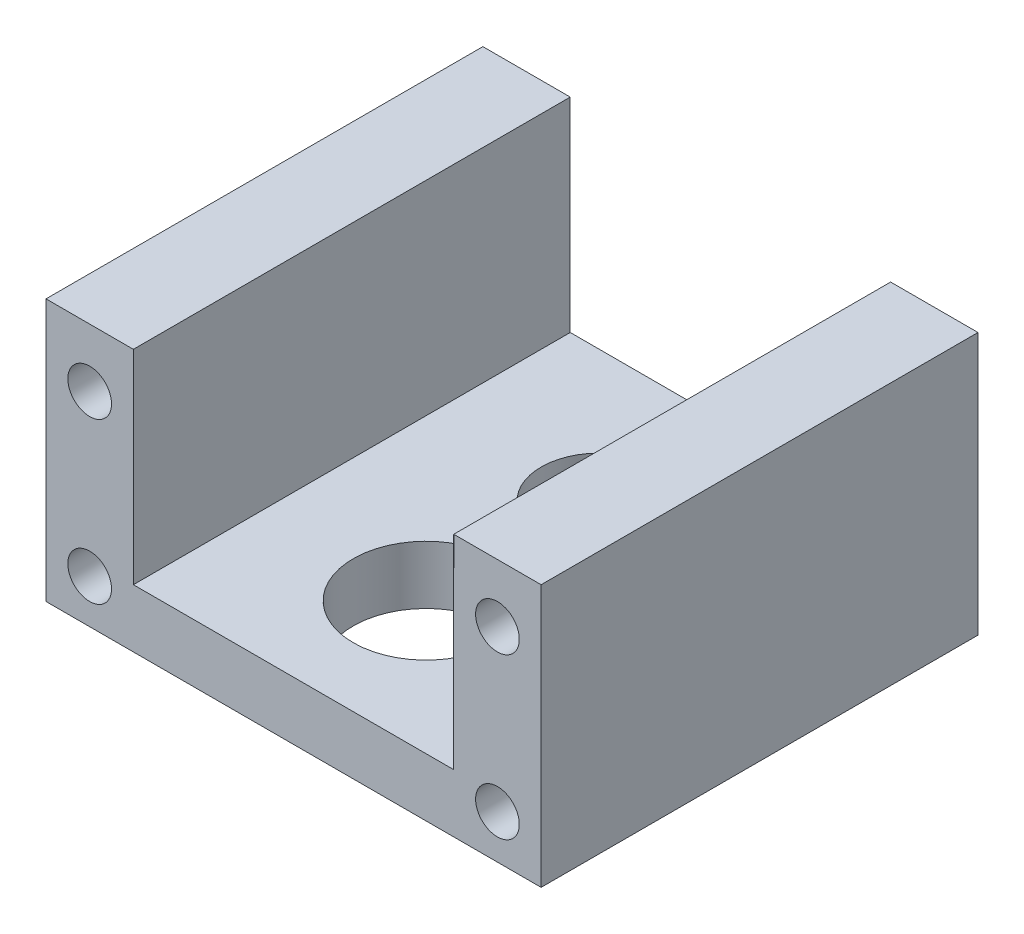
ISO-10303-21;
HEADER;
FILE_DESCRIPTION(('STEP AP214'),'2;1');
FILE_NAME('part.step','',(''),(''),'','','');
FILE_SCHEMA(('AUTOMOTIVE_DESIGN { 1 0 10303 214 1 1 1 1 }'));
ENDSEC;
DATA;
#1=APPLICATION_CONTEXT('core data for automotive mechanical design processes');
#2=APPLICATION_PROTOCOL_DEFINITION('international standard','automotive_design',2000,#1);
#3=PRODUCT_CONTEXT('',#1,'mechanical');
#4=PRODUCT('Part','Part','',(#3));
#5=PRODUCT_RELATED_PRODUCT_CATEGORY('part','',(#4));
#6=PRODUCT_DEFINITION_FORMATION('','',#4);
#7=PRODUCT_DEFINITION_CONTEXT('part definition',#1,'design');
#8=PRODUCT_DEFINITION('design','',#6,#7);
#9=PRODUCT_DEFINITION_SHAPE('','',#8);
#10=(LENGTH_UNIT() NAMED_UNIT(*) SI_UNIT(.MILLI.,.METRE.));
#11=(NAMED_UNIT(*) PLANE_ANGLE_UNIT() SI_UNIT($,.RADIAN.));
#12=(NAMED_UNIT(*) SI_UNIT($,.STERADIAN.) SOLID_ANGLE_UNIT());
#13=UNCERTAINTY_MEASURE_WITH_UNIT(LENGTH_MEASURE(1.E-05),#10,'distance_accuracy_value','');
#14=(GEOMETRIC_REPRESENTATION_CONTEXT(3) GLOBAL_UNCERTAINTY_ASSIGNED_CONTEXT((#13)) GLOBAL_UNIT_ASSIGNED_CONTEXT((#10,
#11,#12)) REPRESENTATION_CONTEXT('',''));
#15=CARTESIAN_POINT('',(0.,0.,0.));
#16=DIRECTION('',(0.,0.,1.));
#17=DIRECTION('',(1.,0.,0.));
#18=AXIS2_PLACEMENT_3D('',#15,#16,#17);
#19=CARTESIAN_POINT('',(0.,4.,0.));
#20=DIRECTION('',(0.,1.,0.));
#21=DIRECTION('',(0.,0.,1.));
#22=AXIS2_PLACEMENT_3D('',#19,#20,#21);
#23=PLANE('',#22);
#24=CARTESIAN_POINT('',(0.,4.,-6.));
#25=DIRECTION('',(0.,1.,0.));
#26=DIRECTION('',(0.,0.,1.));
#27=AXIS2_PLACEMENT_3D('',#24,#25,#26);
#28=CIRCLE('',#27,4.);
#29=CARTESIAN_POINT('',(0.,4.,-2.));
#30=VERTEX_POINT('',#29);
#31=EDGE_CURVE('E180',#30,#30,#28,.T.);
#32=ORIENTED_EDGE('',*,*,#31,.F.);
#33=EDGE_LOOP('',(#32));
#34=FACE_BOUND('',#33,.T.);
#35=CARTESIAN_POINT('',(0.,4.,5.9));
#36=DIRECTION('',(0.,1.,0.));
#37=DIRECTION('',(0.,0.,1.));
#38=AXIS2_PLACEMENT_3D('',#35,#36,#37);
#39=CIRCLE('',#38,5.);
#40=CARTESIAN_POINT('',(0.,4.,10.9));
#41=VERTEX_POINT('',#40);
#42=EDGE_CURVE('E181',#41,#41,#39,.T.);
#43=ORIENTED_EDGE('',*,*,#42,.F.);
#44=EDGE_LOOP('',(#43));
#45=FACE_BOUND('',#44,.T.);
#46=DIRECTION('',(-1.,0.,0.));
#47=VECTOR('',#46,1.);
#48=CARTESIAN_POINT('',(0.,4.,15.));
#49=LINE('',#48,#47);
#50=CARTESIAN_POINT('',(11.,4.,15.));
#51=VERTEX_POINT('',#50);
#52=CARTESIAN_POINT('',(-11.,4.,15.));
#53=VERTEX_POINT('',#52);
#54=EDGE_CURVE('E185',#51,#53,#49,.T.);
#55=ORIENTED_EDGE('',*,*,#54,.F.);
#56=DIRECTION('',(0.,0.,1.));
#57=VECTOR('',#56,1.);
#58=CARTESIAN_POINT('',(11.,4.,-15.));
#59=LINE('',#58,#57);
#60=CARTESIAN_POINT('',(11.,4.,-15.));
#61=VERTEX_POINT('',#60);
#62=EDGE_CURVE('E245',#61,#51,#59,.T.);
#63=ORIENTED_EDGE('',*,*,#62,.F.);
#64=DIRECTION('',(-1.,0.,0.));
#65=VECTOR('',#64,1.);
#66=CARTESIAN_POINT('',(0.,4.,-15.));
#67=LINE('',#66,#65);
#68=CARTESIAN_POINT('',(-11.,4.,-15.));
#69=VERTEX_POINT('',#68);
#70=EDGE_CURVE('E196',#61,#69,#67,.T.);
#71=ORIENTED_EDGE('',*,*,#70,.T.);
#72=DIRECTION('',(0.,0.,-1.));
#73=VECTOR('',#72,1.);
#74=CARTESIAN_POINT('',(-11.,4.,-15.));
#75=LINE('',#74,#73);
#76=EDGE_CURVE('E253',#53,#69,#75,.T.);
#77=ORIENTED_EDGE('',*,*,#76,.F.);
#78=EDGE_LOOP('',(#55,#63,#71,#77));
#79=FACE_BOUND('',#78,.T.);
#80=ADVANCED_FACE('F38',(#34,#45,#79),#23,.T.);
#81=CARTESIAN_POINT('',(-17.,4.,0.));
#82=DIRECTION('',(-1.,0.,0.));
#83=DIRECTION('',(0.,0.,1.));
#84=AXIS2_PLACEMENT_3D('',#81,#82,#83);
#85=PLANE('',#84);
#86=DIRECTION('',(0.,0.,-1.));
#87=VECTOR('',#86,1.);
#88=CARTESIAN_POINT('',(-17.,18.,15.));
#89=LINE('',#88,#87);
#90=CARTESIAN_POINT('',(-17.,18.,15.));
#91=VERTEX_POINT('',#90);
#92=CARTESIAN_POINT('',(-17.,18.,-15.));
#93=VERTEX_POINT('',#92);
#94=EDGE_CURVE('E117',#91,#93,#89,.T.);
#95=ORIENTED_EDGE('',*,*,#94,.T.);
#96=DIRECTION('',(0.,-1.,0.));
#97=VECTOR('',#96,1.);
#98=CARTESIAN_POINT('',(-17.,4.,-15.));
#99=LINE('',#98,#97);
#100=CARTESIAN_POINT('',(-17.,0.,-15.));
#101=VERTEX_POINT('',#100);
#102=EDGE_CURVE('E127',#93,#101,#99,.T.);
#103=ORIENTED_EDGE('',*,*,#102,.T.);
#104=DIRECTION('',(0.,0.,-1.));
#105=VECTOR('',#104,1.);
#106=CARTESIAN_POINT('',(-17.,0.,0.));
#107=LINE('',#106,#105);
#108=CARTESIAN_POINT('',(-17.,0.,15.));
#109=VERTEX_POINT('',#108);
#110=EDGE_CURVE('E202',#109,#101,#107,.T.);
#111=ORIENTED_EDGE('',*,*,#110,.F.);
#112=DIRECTION('',(0.,-1.,0.));
#113=VECTOR('',#112,1.);
#114=CARTESIAN_POINT('',(-17.,4.,15.));
#115=LINE('',#114,#113);
#116=EDGE_CURVE('E124',#91,#109,#115,.T.);
#117=ORIENTED_EDGE('',*,*,#116,.F.);
#118=EDGE_LOOP('',(#95,#103,#111,#117));
#119=FACE_BOUND('',#118,.T.);
#120=ADVANCED_FACE('F146',(#119),#85,.T.);
#121=CARTESIAN_POINT('',(0.,4.,15.));
#122=DIRECTION('',(0.,0.,1.));
#123=DIRECTION('',(1.,0.,0.));
#124=AXIS2_PLACEMENT_3D('',#121,#122,#123);
#125=PLANE('',#124);
#126=DIRECTION('',(-1.,0.,0.));
#127=VECTOR('',#126,1.);
#128=CARTESIAN_POINT('',(-17.,18.,15.));
#129=LINE('',#128,#127);
#130=CARTESIAN_POINT('',(-11.,18.,15.));
#131=VERTEX_POINT('',#130);
#132=EDGE_CURVE('E53',#131,#91,#129,.T.);
#133=ORIENTED_EDGE('',*,*,#132,.T.);
#134=ORIENTED_EDGE('',*,*,#116,.T.);
#135=DIRECTION('',(-1.,0.,0.));
#136=VECTOR('',#135,1.);
#137=CARTESIAN_POINT('',(0.,0.,15.));
#138=LINE('',#137,#136);
#139=CARTESIAN_POINT('',(17.,0.,15.));
#140=VERTEX_POINT('',#139);
#141=EDGE_CURVE('E123',#140,#109,#138,.T.);
#142=ORIENTED_EDGE('',*,*,#141,.F.);
#143=DIRECTION('',(0.,-1.,0.));
#144=VECTOR('',#143,1.);
#145=CARTESIAN_POINT('',(17.,4.,15.));
#146=LINE('',#145,#144);
#147=CARTESIAN_POINT('',(17.,18.,15.));
#148=VERTEX_POINT('',#147);
#149=EDGE_CURVE('E114',#148,#140,#146,.T.);
#150=ORIENTED_EDGE('',*,*,#149,.F.);
#151=CARTESIAN_POINT('',(11.,18.,15.));
#152=VERTEX_POINT('',#151);
#153=EDGE_CURVE('E101',#148,#152,#129,.T.);
#154=ORIENTED_EDGE('',*,*,#153,.T.);
#155=DIRECTION('',(0.,-1.,0.));
#156=VECTOR('',#155,1.);
#157=CARTESIAN_POINT('',(11.,19.,15.));
#158=LINE('',#157,#156);
#159=EDGE_CURVE('E250',#152,#51,#158,.T.);
#160=ORIENTED_EDGE('',*,*,#159,.T.);
#161=ORIENTED_EDGE('',*,*,#54,.T.);
#162=DIRECTION('',(0.,-1.,0.));
#163=VECTOR('',#162,1.);
#164=CARTESIAN_POINT('',(-11.,19.,15.));
#165=LINE('',#164,#163);
#166=EDGE_CURVE('E191',#131,#53,#165,.T.);
#167=ORIENTED_EDGE('',*,*,#166,.F.);
#168=EDGE_LOOP('',(#133,#134,#142,#150,#154,#160,#161,#167));
#169=FACE_BOUND('',#168,.T.);
#170=CARTESIAN_POINT('',(14.,14.,15.));
#171=DIRECTION('',(0.,0.,-1.));
#172=DIRECTION('',(-1.,0.,0.));
#173=AXIS2_PLACEMENT_3D('',#170,#171,#172);
#174=CIRCLE('',#173,1.5);
#175=CARTESIAN_POINT('',(12.5,14.,15.));
#176=VERTEX_POINT('',#175);
#177=EDGE_CURVE('E230',#176,#176,#174,.T.);
#178=ORIENTED_EDGE('',*,*,#177,.T.);
#179=EDGE_LOOP('',(#178));
#180=FACE_BOUND('',#179,.T.);
#181=CARTESIAN_POINT('',(-14.,3.,15.));
#182=DIRECTION('',(0.,0.,-1.));
#183=DIRECTION('',(1.,0.,0.));
#184=AXIS2_PLACEMENT_3D('',#181,#182,#183);
#185=CIRCLE('',#184,1.5);
#186=CARTESIAN_POINT('',(-12.5,3.,15.));
#187=VERTEX_POINT('',#186);
#188=EDGE_CURVE('E237',#187,#187,#185,.T.);
#189=ORIENTED_EDGE('',*,*,#188,.T.);
#190=EDGE_LOOP('',(#189));
#191=FACE_BOUND('',#190,.T.);
#192=CARTESIAN_POINT('',(-14.,14.,15.));
#193=DIRECTION('',(0.,0.,-1.));
#194=DIRECTION('',(1.,0.,0.));
#195=AXIS2_PLACEMENT_3D('',#192,#193,#194);
#196=CIRCLE('',#195,1.5);
#197=CARTESIAN_POINT('',(-12.5,14.,15.));
#198=VERTEX_POINT('',#197);
#199=EDGE_CURVE('E224',#198,#198,#196,.T.);
#200=ORIENTED_EDGE('',*,*,#199,.T.);
#201=EDGE_LOOP('',(#200));
#202=FACE_BOUND('',#201,.T.);
#203=CARTESIAN_POINT('',(14.,3.,15.));
#204=DIRECTION('',(0.,0.,-1.));
#205=DIRECTION('',(-1.,0.,0.));
#206=AXIS2_PLACEMENT_3D('',#203,#204,#205);
#207=CIRCLE('',#206,1.5);
#208=CARTESIAN_POINT('',(12.5,3.,15.));
#209=VERTEX_POINT('',#208);
#210=EDGE_CURVE('E242',#209,#209,#207,.T.);
#211=ORIENTED_EDGE('',*,*,#210,.T.);
#212=EDGE_LOOP('',(#211));
#213=FACE_BOUND('',#212,.T.);
#214=ADVANCED_FACE('F120',(#169,#180,#191,#202,#213),#125,.T.);
#215=CARTESIAN_POINT('',(17.,4.,0.));
#216=DIRECTION('',(-1.,0.,0.));
#217=DIRECTION('',(0.,0.,1.));
#218=AXIS2_PLACEMENT_3D('',#215,#216,#217);
#219=PLANE('',#218);
#220=DIRECTION('',(0.,-1.,0.));
#221=VECTOR('',#220,1.);
#222=CARTESIAN_POINT('',(17.,4.,-15.));
#223=LINE('',#222,#221);
#224=CARTESIAN_POINT('',(17.,18.,-15.));
#225=VERTEX_POINT('',#224);
#226=CARTESIAN_POINT('',(17.,0.,-15.));
#227=VERTEX_POINT('',#226);
#228=EDGE_CURVE('E116',#225,#227,#223,.T.);
#229=ORIENTED_EDGE('',*,*,#228,.F.);
#230=DIRECTION('',(0.,0.,-1.));
#231=VECTOR('',#230,1.);
#232=CARTESIAN_POINT('',(17.,18.,15.));
#233=LINE('',#232,#231);
#234=EDGE_CURVE('E104',#148,#225,#233,.T.);
#235=ORIENTED_EDGE('',*,*,#234,.F.);
#236=ORIENTED_EDGE('',*,*,#149,.T.);
#237=DIRECTION('',(0.,0.,-1.));
#238=VECTOR('',#237,1.);
#239=CARTESIAN_POINT('',(17.,0.,0.));
#240=LINE('',#239,#238);
#241=EDGE_CURVE('E188',#140,#227,#240,.T.);
#242=ORIENTED_EDGE('',*,*,#241,.T.);
#243=EDGE_LOOP('',(#229,#235,#236,#242));
#244=FACE_BOUND('',#243,.T.);
#245=ADVANCED_FACE('F112',(#244),#219,.F.);
#246=CARTESIAN_POINT('',(0.,4.,5.9));
#247=DIRECTION('',(0.,-1.,0.));
#248=DIRECTION('',(0.,0.,-1.));
#249=AXIS2_PLACEMENT_3D('',#246,#247,#248);
#250=CYLINDRICAL_SURFACE('',#249,5.);
#251=ORIENTED_EDGE('',*,*,#42,.T.);
#252=EDGE_LOOP('',(#251));
#253=FACE_BOUND('',#252,.T.);
#254=CARTESIAN_POINT('',(0.,0.,5.9));
#255=DIRECTION('',(0.,1.,0.));
#256=DIRECTION('',(0.,0.,1.));
#257=AXIS2_PLACEMENT_3D('',#254,#255,#256);
#258=CIRCLE('',#257,5.);
#259=CARTESIAN_POINT('',(0.,0.,10.9));
#260=VERTEX_POINT('',#259);
#261=EDGE_CURVE('E199',#260,#260,#258,.T.);
#262=ORIENTED_EDGE('',*,*,#261,.F.);
#263=EDGE_LOOP('',(#262));
#264=FACE_BOUND('',#263,.T.);
#265=ADVANCED_FACE('F169',(#253,#264),#250,.F.);
#266=CARTESIAN_POINT('',(0.,4.,-6.));
#267=DIRECTION('',(0.,-1.,0.));
#268=DIRECTION('',(0.,0.,-1.));
#269=AXIS2_PLACEMENT_3D('',#266,#267,#268);
#270=CYLINDRICAL_SURFACE('',#269,4.);
#271=CARTESIAN_POINT('',(0.,1.,-6.));
#272=DIRECTION('',(0.,1.,0.));
#273=DIRECTION('',(0.,0.,1.));
#274=AXIS2_PLACEMENT_3D('',#271,#272,#273);
#275=CIRCLE('',#274,4.);
#276=CARTESIAN_POINT('',(0.,1.,-2.));
#277=VERTEX_POINT('',#276);
#278=EDGE_CURVE('E11',#277,#277,#275,.F.);
#279=ORIENTED_EDGE('',*,*,#278,.T.);
#280=EDGE_LOOP('',(#279));
#281=FACE_BOUND('',#280,.T.);
#282=ORIENTED_EDGE('',*,*,#31,.T.);
#283=EDGE_LOOP('',(#282));
#284=FACE_BOUND('',#283,.T.);
#285=ADVANCED_FACE('F165',(#281,#284),#270,.F.);
#286=CARTESIAN_POINT('',(0.,4.,-15.));
#287=DIRECTION('',(0.,0.,1.));
#288=DIRECTION('',(1.,0.,0.));
#289=AXIS2_PLACEMENT_3D('',#286,#287,#288);
#290=PLANE('',#289);
#291=CARTESIAN_POINT('',(14.,14.,-15.));
#292=DIRECTION('',(0.,0.,-1.));
#293=DIRECTION('',(-1.,0.,0.));
#294=AXIS2_PLACEMENT_3D('',#291,#292,#293);
#295=CIRCLE('',#294,1.5);
#296=CARTESIAN_POINT('',(12.5,14.,-15.));
#297=VERTEX_POINT('',#296);
#298=EDGE_CURVE('E234',#297,#297,#295,.T.);
#299=ORIENTED_EDGE('',*,*,#298,.F.);
#300=EDGE_LOOP('',(#299));
#301=FACE_BOUND('',#300,.T.);
#302=CARTESIAN_POINT('',(-14.,3.,-15.));
#303=DIRECTION('',(0.,0.,-1.));
#304=DIRECTION('',(1.,0.,0.));
#305=AXIS2_PLACEMENT_3D('',#302,#303,#304);
#306=CIRCLE('',#305,1.5);
#307=CARTESIAN_POINT('',(-12.5,3.,-15.));
#308=VERTEX_POINT('',#307);
#309=EDGE_CURVE('E227',#308,#308,#306,.T.);
#310=ORIENTED_EDGE('',*,*,#309,.F.);
#311=EDGE_LOOP('',(#310));
#312=FACE_BOUND('',#311,.T.);
#313=CARTESIAN_POINT('',(-14.,14.,-15.));
#314=DIRECTION('',(0.,0.,-1.));
#315=DIRECTION('',(1.,0.,0.));
#316=AXIS2_PLACEMENT_3D('',#313,#314,#315);
#317=CIRCLE('',#316,1.5);
#318=CARTESIAN_POINT('',(-12.5,14.,-15.));
#319=VERTEX_POINT('',#318);
#320=EDGE_CURVE('E223',#319,#319,#317,.T.);
#321=ORIENTED_EDGE('',*,*,#320,.F.);
#322=EDGE_LOOP('',(#321));
#323=FACE_BOUND('',#322,.T.);
#324=CARTESIAN_POINT('',(14.,3.,-15.));
#325=DIRECTION('',(0.,0.,-1.));
#326=DIRECTION('',(-1.,0.,0.));
#327=AXIS2_PLACEMENT_3D('',#324,#325,#326);
#328=CIRCLE('',#327,1.5);
#329=CARTESIAN_POINT('',(12.5,3.,-15.));
#330=VERTEX_POINT('',#329);
#331=EDGE_CURVE('E233',#330,#330,#328,.T.);
#332=ORIENTED_EDGE('',*,*,#331,.F.);
#333=EDGE_LOOP('',(#332));
#334=FACE_BOUND('',#333,.T.);
#335=ORIENTED_EDGE('',*,*,#102,.F.);
#336=DIRECTION('',(-1.,0.,0.));
#337=VECTOR('',#336,1.);
#338=CARTESIAN_POINT('',(-17.,18.,-15.));
#339=LINE('',#338,#337);
#340=CARTESIAN_POINT('',(-11.,18.,-15.));
#341=VERTEX_POINT('',#340);
#342=EDGE_CURVE('E217',#341,#93,#339,.T.);
#343=ORIENTED_EDGE('',*,*,#342,.F.);
#344=DIRECTION('',(0.,-1.,0.));
#345=VECTOR('',#344,1.);
#346=CARTESIAN_POINT('',(-11.,19.,-15.));
#347=LINE('',#346,#345);
#348=EDGE_CURVE('E255',#341,#69,#347,.T.);
#349=ORIENTED_EDGE('',*,*,#348,.T.);
#350=ORIENTED_EDGE('',*,*,#70,.F.);
#351=DIRECTION('',(0.,-1.,0.));
#352=VECTOR('',#351,1.);
#353=CARTESIAN_POINT('',(11.,19.,-15.));
#354=LINE('',#353,#352);
#355=CARTESIAN_POINT('',(11.,18.,-15.));
#356=VERTEX_POINT('',#355);
#357=EDGE_CURVE('E216',#356,#61,#354,.T.);
#358=ORIENTED_EDGE('',*,*,#357,.F.);
#359=EDGE_CURVE('E61',#225,#356,#339,.T.);
#360=ORIENTED_EDGE('',*,*,#359,.F.);
#361=ORIENTED_EDGE('',*,*,#228,.T.);
#362=DIRECTION('',(-1.,0.,0.));
#363=VECTOR('',#362,1.);
#364=CARTESIAN_POINT('',(0.,0.,-15.));
#365=LINE('',#364,#363);
#366=EDGE_CURVE('E182',#227,#101,#365,.T.);
#367=ORIENTED_EDGE('',*,*,#366,.T.);
#368=EDGE_LOOP('',(#335,#343,#349,#350,#358,#360,#361,#367));
#369=FACE_BOUND('',#368,.T.);
#370=ADVANCED_FACE('F162',(#301,#312,#323,#334,#369),#290,.F.);
#371=CARTESIAN_POINT('',(0.,0.,0.));
#372=DIRECTION('',(0.,1.,0.));
#373=DIRECTION('',(0.,0.,1.));
#374=AXIS2_PLACEMENT_3D('',#371,#372,#373);
#375=PLANE('',#374);
#376=CARTESIAN_POINT('',(0.,0.,-6.));
#377=DIRECTION('',(0.,1.,0.));
#378=DIRECTION('',(0.,0.,1.));
#379=AXIS2_PLACEMENT_3D('',#376,#377,#378);
#380=CIRCLE('',#379,5.);
#381=CARTESIAN_POINT('',(0.,0.,-0.999999999999994));
#382=VERTEX_POINT('',#381);
#383=EDGE_CURVE('E46',#382,#382,#380,.T.);
#384=ORIENTED_EDGE('',*,*,#383,.T.);
#385=EDGE_LOOP('',(#384));
#386=FACE_BOUND('',#385,.T.);
#387=ORIENTED_EDGE('',*,*,#261,.T.);
#388=EDGE_LOOP('',(#387));
#389=FACE_BOUND('',#388,.T.);
#390=ORIENTED_EDGE('',*,*,#110,.T.);
#391=ORIENTED_EDGE('',*,*,#366,.F.);
#392=ORIENTED_EDGE('',*,*,#241,.F.);
#393=ORIENTED_EDGE('',*,*,#141,.T.);
#394=EDGE_LOOP('',(#390,#391,#392,#393));
#395=FACE_BOUND('',#394,.T.);
#396=ADVANCED_FACE('F134',(#386,#389,#395),#375,.F.);
#397=CARTESIAN_POINT('',(-11.,19.,-15.));
#398=DIRECTION('',(-1.,0.,0.));
#399=DIRECTION('',(0.,0.,1.));
#400=AXIS2_PLACEMENT_3D('',#397,#398,#399);
#401=PLANE('',#400);
#402=ORIENTED_EDGE('',*,*,#348,.F.);
#403=DIRECTION('',(0.,0.,1.));
#404=VECTOR('',#403,1.);
#405=CARTESIAN_POINT('',(-11.,18.,-15.));
#406=LINE('',#405,#404);
#407=EDGE_CURVE('E220',#341,#131,#406,.T.);
#408=ORIENTED_EDGE('',*,*,#407,.T.);
#409=ORIENTED_EDGE('',*,*,#166,.T.);
#410=ORIENTED_EDGE('',*,*,#76,.T.);
#411=EDGE_LOOP('',(#402,#408,#409,#410));
#412=FACE_BOUND('',#411,.T.);
#413=ADVANCED_FACE('F158',(#412),#401,.F.);
#414=CARTESIAN_POINT('',(11.,19.,-15.));
#415=DIRECTION('',(1.,0.,0.));
#416=DIRECTION('',(0.,0.,-1.));
#417=AXIS2_PLACEMENT_3D('',#414,#415,#416);
#418=PLANE('',#417);
#419=ORIENTED_EDGE('',*,*,#159,.F.);
#420=DIRECTION('',(0.,0.,-1.));
#421=VECTOR('',#420,1.);
#422=CARTESIAN_POINT('',(11.,18.,-15.));
#423=LINE('',#422,#421);
#424=EDGE_CURVE('E105',#152,#356,#423,.T.);
#425=ORIENTED_EDGE('',*,*,#424,.T.);
#426=ORIENTED_EDGE('',*,*,#357,.T.);
#427=ORIENTED_EDGE('',*,*,#62,.T.);
#428=EDGE_LOOP('',(#419,#425,#426,#427));
#429=FACE_BOUND('',#428,.T.);
#430=ADVANCED_FACE('F264',(#429),#418,.F.);
#431=CARTESIAN_POINT('',(14.,3.,15.));
#432=DIRECTION('',(0.,0.,-1.));
#433=DIRECTION('',(-1.,0.,0.));
#434=AXIS2_PLACEMENT_3D('',#431,#432,#433);
#435=CYLINDRICAL_SURFACE('',#434,1.5);
#436=ORIENTED_EDGE('',*,*,#210,.F.);
#437=EDGE_LOOP('',(#436));
#438=FACE_BOUND('',#437,.T.);
#439=ORIENTED_EDGE('',*,*,#331,.T.);
#440=EDGE_LOOP('',(#439));
#441=FACE_BOUND('',#440,.T.);
#442=ADVANCED_FACE('F266',(#438,#441),#435,.F.);
#443=CARTESIAN_POINT('',(-14.,14.,15.));
#444=DIRECTION('',(0.,0.,-1.));
#445=DIRECTION('',(-1.,0.,0.));
#446=AXIS2_PLACEMENT_3D('',#443,#444,#445);
#447=CYLINDRICAL_SURFACE('',#446,1.5);
#448=ORIENTED_EDGE('',*,*,#199,.F.);
#449=EDGE_LOOP('',(#448));
#450=FACE_BOUND('',#449,.T.);
#451=ORIENTED_EDGE('',*,*,#320,.T.);
#452=EDGE_LOOP('',(#451));
#453=FACE_BOUND('',#452,.T.);
#454=ADVANCED_FACE('F271',(#450,#453),#447,.F.);
#455=CARTESIAN_POINT('',(-14.,3.,15.));
#456=DIRECTION('',(0.,0.,-1.));
#457=DIRECTION('',(-1.,0.,0.));
#458=AXIS2_PLACEMENT_3D('',#455,#456,#457);
#459=CYLINDRICAL_SURFACE('',#458,1.5);
#460=ORIENTED_EDGE('',*,*,#188,.F.);
#461=EDGE_LOOP('',(#460));
#462=FACE_BOUND('',#461,.T.);
#463=ORIENTED_EDGE('',*,*,#309,.T.);
#464=EDGE_LOOP('',(#463));
#465=FACE_BOUND('',#464,.T.);
#466=ADVANCED_FACE('F275',(#462,#465),#459,.F.);
#467=CARTESIAN_POINT('',(14.,14.,15.));
#468=DIRECTION('',(0.,0.,-1.));
#469=DIRECTION('',(-1.,0.,0.));
#470=AXIS2_PLACEMENT_3D('',#467,#468,#469);
#471=CYLINDRICAL_SURFACE('',#470,1.5);
#472=ORIENTED_EDGE('',*,*,#177,.F.);
#473=EDGE_LOOP('',(#472));
#474=FACE_BOUND('',#473,.T.);
#475=ORIENTED_EDGE('',*,*,#298,.T.);
#476=EDGE_LOOP('',(#475));
#477=FACE_BOUND('',#476,.T.);
#478=ADVANCED_FACE('F278',(#474,#477),#471,.F.);
#479=CARTESIAN_POINT('',(-17.,18.,15.));
#480=DIRECTION('',(0.,-1.,0.));
#481=DIRECTION('',(0.,0.,-1.));
#482=AXIS2_PLACEMENT_3D('',#479,#480,#481);
#483=PLANE('',#482);
#484=ORIENTED_EDGE('',*,*,#153,.F.);
#485=ORIENTED_EDGE('',*,*,#234,.T.);
#486=ORIENTED_EDGE('',*,*,#359,.T.);
#487=ORIENTED_EDGE('',*,*,#424,.F.);
#488=EDGE_LOOP('',(#484,#485,#486,#487));
#489=FACE_BOUND('',#488,.T.);
#490=ADVANCED_FACE('F103',(#489),#483,.F.);
#491=ORIENTED_EDGE('',*,*,#342,.T.);
#492=ORIENTED_EDGE('',*,*,#94,.F.);
#493=ORIENTED_EDGE('',*,*,#132,.F.);
#494=ORIENTED_EDGE('',*,*,#407,.F.);
#495=EDGE_LOOP('',(#491,#492,#493,#494));
#496=FACE_BOUND('',#495,.T.);
#497=ADVANCED_FACE('F138',(#496),#483,.F.);
#498=CARTESIAN_POINT('',(0.,0.,-6.));
#499=DIRECTION('',(0.,-1.,0.));
#500=DIRECTION('',(0.,0.,-1.));
#501=AXIS2_PLACEMENT_3D('',#498,#499,#500);
#502=CONICAL_SURFACE('',#501,5.,0.785398163397449);
#503=ORIENTED_EDGE('',*,*,#278,.F.);
#504=EDGE_LOOP('',(#503));
#505=FACE_BOUND('',#504,.T.);
#506=ORIENTED_EDGE('',*,*,#383,.F.);
#507=EDGE_LOOP('',(#506));
#508=FACE_BOUND('',#507,.T.);
#509=ADVANCED_FACE('F40',(#505,#508),#502,.F.);
#510=CLOSED_SHELL('',(#80,#120,#214,#245,#265,#285,#370,#396,#413,#430,#442,#454,#466,#478,#490,
#497,#509));
#511=MANIFOLD_SOLID_BREP('B2',#510);
#512=ADVANCED_BREP_SHAPE_REPRESENTATION('',(#18,#511),#14);
#513=SHAPE_DEFINITION_REPRESENTATION(#9,#512);
ENDSEC;
END-ISO-10303-21;
